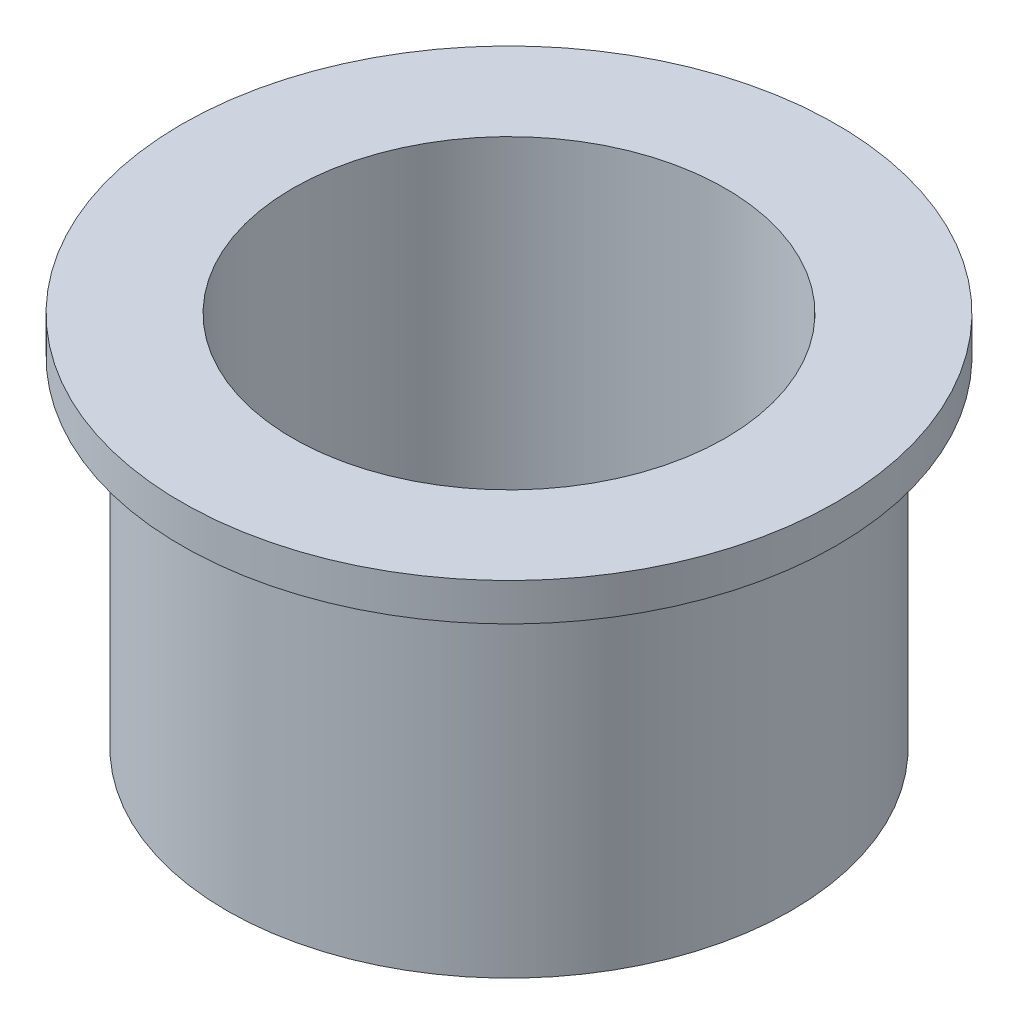
ISO-10303-21;
HEADER;
FILE_DESCRIPTION(('STEP AP214'),'2;1');
FILE_NAME('part.step','',(''),(''),'','','');
FILE_SCHEMA(('AUTOMOTIVE_DESIGN { 1 0 10303 214 1 1 1 1 }'));
ENDSEC;
DATA;
#1=APPLICATION_CONTEXT('core data for automotive mechanical design processes');
#2=APPLICATION_PROTOCOL_DEFINITION('international standard','automotive_design',2000,#1);
#3=PRODUCT_CONTEXT('',#1,'mechanical');
#4=PRODUCT('Part','Part','',(#3));
#5=PRODUCT_RELATED_PRODUCT_CATEGORY('part','',(#4));
#6=PRODUCT_DEFINITION_FORMATION('','',#4);
#7=PRODUCT_DEFINITION_CONTEXT('part definition',#1,'design');
#8=PRODUCT_DEFINITION('design','',#6,#7);
#9=PRODUCT_DEFINITION_SHAPE('','',#8);
#10=(LENGTH_UNIT() NAMED_UNIT(*) SI_UNIT(.MILLI.,.METRE.));
#11=(NAMED_UNIT(*) PLANE_ANGLE_UNIT() SI_UNIT($,.RADIAN.));
#12=(NAMED_UNIT(*) SI_UNIT($,.STERADIAN.) SOLID_ANGLE_UNIT());
#13=UNCERTAINTY_MEASURE_WITH_UNIT(LENGTH_MEASURE(1.E-05),#10,'distance_accuracy_value','');
#14=(GEOMETRIC_REPRESENTATION_CONTEXT(3) GLOBAL_UNCERTAINTY_ASSIGNED_CONTEXT((#13)) GLOBAL_UNIT_ASSIGNED_CONTEXT((#10,
#11,#12)) REPRESENTATION_CONTEXT('',''));
#15=CARTESIAN_POINT('',(0.,0.,0.));
#16=DIRECTION('',(0.,0.,1.));
#17=DIRECTION('',(1.,0.,0.));
#18=AXIS2_PLACEMENT_3D('',#15,#16,#17);
#19=CARTESIAN_POINT('',(0.,0.5,0.));
#20=DIRECTION('',(0.,-1.,0.));
#21=DIRECTION('',(-1.,0.,0.));
#22=AXIS2_PLACEMENT_3D('',#19,#20,#21);
#23=CYLINDRICAL_SURFACE('',#22,5.75);
#24=CARTESIAN_POINT('',(0.,-10.,0.));
#25=DIRECTION('',(0.,-1.,0.));
#26=DIRECTION('',(1.,0.,0.));
#27=AXIS2_PLACEMENT_3D('',#24,#25,#26);
#28=CIRCLE('',#27,5.75);
#29=CARTESIAN_POINT('',(5.75,-10.,0.));
#30=VERTEX_POINT('',#29);
#31=EDGE_CURVE('E10',#30,#30,#28,.T.);
#32=ORIENTED_EDGE('',*,*,#31,.T.);
#33=EDGE_LOOP('',(#32));
#34=FACE_BOUND('',#33,.T.);
#35=CARTESIAN_POINT('',(0.,0.,0.));
#36=DIRECTION('',(0.,-1.,0.));
#37=DIRECTION('',(1.,0.,0.));
#38=AXIS2_PLACEMENT_3D('',#35,#36,#37);
#39=CIRCLE('',#38,5.75);
#40=CARTESIAN_POINT('',(5.75,0.,0.));
#41=VERTEX_POINT('',#40);
#42=EDGE_CURVE('E31',#41,#41,#39,.T.);
#43=ORIENTED_EDGE('',*,*,#42,.F.);
#44=EDGE_LOOP('',(#43));
#45=FACE_BOUND('',#44,.T.);
#46=ADVANCED_FACE('F15',(#34,#45),#23,.F.);
#47=CARTESIAN_POINT('',(0.,-10.,0.));
#48=DIRECTION('',(0.,-1.,0.));
#49=DIRECTION('',(-1.,0.,0.));
#50=AXIS2_PLACEMENT_3D('',#47,#48,#49);
#51=PLANE('',#50);
#52=CARTESIAN_POINT('',(0.,-10.,0.));
#53=DIRECTION('',(0.,1.,0.));
#54=DIRECTION('',(1.,0.,0.));
#55=AXIS2_PLACEMENT_3D('',#52,#53,#54);
#56=CIRCLE('',#55,7.5);
#57=CARTESIAN_POINT('',(7.5,-10.,0.));
#58=VERTEX_POINT('',#57);
#59=EDGE_CURVE('E28',#58,#58,#56,.T.);
#60=ORIENTED_EDGE('',*,*,#59,.F.);
#61=EDGE_LOOP('',(#60));
#62=FACE_BOUND('',#61,.T.);
#63=ORIENTED_EDGE('',*,*,#31,.F.);
#64=EDGE_LOOP('',(#63));
#65=FACE_BOUND('',#64,.T.);
#66=ADVANCED_FACE('F49',(#62,#65),#51,.T.);
#67=CARTESIAN_POINT('',(0.,0.5,0.));
#68=DIRECTION('',(0.,-1.,0.));
#69=DIRECTION('',(-1.,0.,0.));
#70=AXIS2_PLACEMENT_3D('',#67,#68,#69);
#71=CYLINDRICAL_SURFACE('',#70,7.5);
#72=CARTESIAN_POINT('',(0.,-1.,0.));
#73=DIRECTION('',(0.,-1.,0.));
#74=DIRECTION('',(1.,0.,0.));
#75=AXIS2_PLACEMENT_3D('',#72,#73,#74);
#76=CIRCLE('',#75,7.5);
#77=CARTESIAN_POINT('',(7.5,-1.,0.));
#78=VERTEX_POINT('',#77);
#79=EDGE_CURVE('E23',#78,#78,#76,.T.);
#80=ORIENTED_EDGE('',*,*,#79,.T.);
#81=EDGE_LOOP('',(#80));
#82=FACE_BOUND('',#81,.T.);
#83=ORIENTED_EDGE('',*,*,#59,.T.);
#84=EDGE_LOOP('',(#83));
#85=FACE_BOUND('',#84,.T.);
#86=ADVANCED_FACE('F55',(#82,#85),#71,.T.);
#87=CARTESIAN_POINT('',(0.,-1.,0.));
#88=DIRECTION('',(0.,-1.,0.));
#89=DIRECTION('',(-1.,0.,0.));
#90=AXIS2_PLACEMENT_3D('',#87,#88,#89);
#91=PLANE('',#90);
#92=CARTESIAN_POINT('',(0.,-1.,0.));
#93=DIRECTION('',(0.,1.,0.));
#94=DIRECTION('',(1.,0.,0.));
#95=AXIS2_PLACEMENT_3D('',#92,#93,#94);
#96=CIRCLE('',#95,8.7);
#97=CARTESIAN_POINT('',(8.7,-1.,0.));
#98=VERTEX_POINT('',#97);
#99=EDGE_CURVE('E34',#98,#98,#96,.T.);
#100=ORIENTED_EDGE('',*,*,#99,.F.);
#101=EDGE_LOOP('',(#100));
#102=FACE_BOUND('',#101,.T.);
#103=ORIENTED_EDGE('',*,*,#79,.F.);
#104=EDGE_LOOP('',(#103));
#105=FACE_BOUND('',#104,.T.);
#106=ADVANCED_FACE('F61',(#102,#105),#91,.T.);
#107=CARTESIAN_POINT('',(0.,0.5,0.));
#108=DIRECTION('',(0.,-1.,0.));
#109=DIRECTION('',(-1.,0.,0.));
#110=AXIS2_PLACEMENT_3D('',#107,#108,#109);
#111=CYLINDRICAL_SURFACE('',#110,8.7);
#112=CARTESIAN_POINT('',(0.,0.,0.));
#113=DIRECTION('',(0.,-1.,0.));
#114=DIRECTION('',(1.,0.,0.));
#115=AXIS2_PLACEMENT_3D('',#112,#113,#114);
#116=CIRCLE('',#115,8.7);
#117=CARTESIAN_POINT('',(8.7,0.,0.));
#118=VERTEX_POINT('',#117);
#119=EDGE_CURVE('E19',#118,#118,#116,.T.);
#120=ORIENTED_EDGE('',*,*,#119,.T.);
#121=EDGE_LOOP('',(#120));
#122=FACE_BOUND('',#121,.T.);
#123=ORIENTED_EDGE('',*,*,#99,.T.);
#124=EDGE_LOOP('',(#123));
#125=FACE_BOUND('',#124,.T.);
#126=ADVANCED_FACE('F42',(#122,#125),#111,.T.);
#127=CARTESIAN_POINT('',(0.,0.,0.));
#128=DIRECTION('',(0.,-1.,0.));
#129=DIRECTION('',(-1.,0.,0.));
#130=AXIS2_PLACEMENT_3D('',#127,#128,#129);
#131=PLANE('',#130);
#132=ORIENTED_EDGE('',*,*,#119,.F.);
#133=EDGE_LOOP('',(#132));
#134=FACE_BOUND('',#133,.T.);
#135=ORIENTED_EDGE('',*,*,#42,.T.);
#136=EDGE_LOOP('',(#135));
#137=FACE_BOUND('',#136,.T.);
#138=ADVANCED_FACE('F17',(#134,#137),#131,.F.);
#139=CLOSED_SHELL('',(#46,#66,#86,#106,#126,#138));
#140=MANIFOLD_SOLID_BREP('B1',#139);
#141=ADVANCED_BREP_SHAPE_REPRESENTATION('',(#18,#140),#14);
#142=SHAPE_DEFINITION_REPRESENTATION(#9,#141);
ENDSEC;
END-ISO-10303-21;
